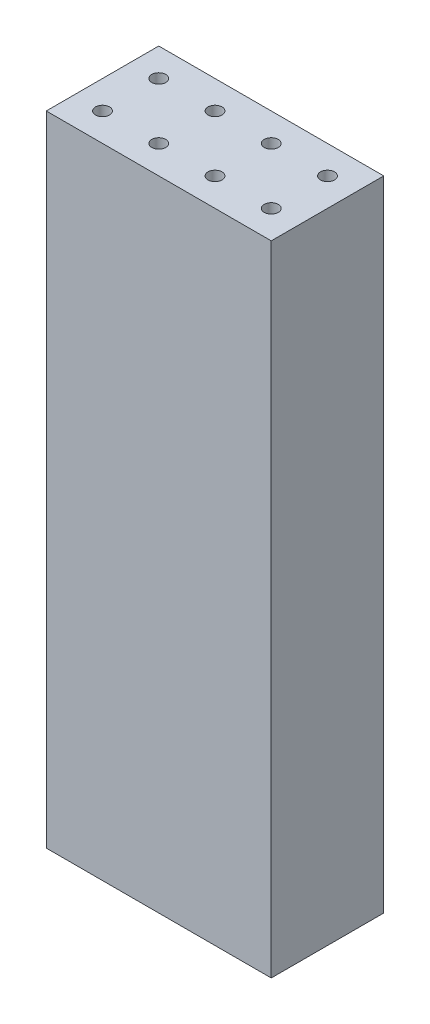
ISO-10303-21;
HEADER;
FILE_DESCRIPTION(('STEP AP214'),'2;1');
FILE_NAME('part.step','',(''),(''),'','','');
FILE_SCHEMA(('AUTOMOTIVE_DESIGN { 1 0 10303 214 1 1 1 1 }'));
ENDSEC;
DATA;
#1=APPLICATION_CONTEXT('core data for automotive mechanical design processes');
#2=APPLICATION_PROTOCOL_DEFINITION('international standard','automotive_design',2000,#1);
#3=PRODUCT_CONTEXT('',#1,'mechanical');
#4=PRODUCT('Part','Part','',(#3));
#5=PRODUCT_RELATED_PRODUCT_CATEGORY('part','',(#4));
#6=PRODUCT_DEFINITION_FORMATION('','',#4);
#7=PRODUCT_DEFINITION_CONTEXT('part definition',#1,'design');
#8=PRODUCT_DEFINITION('design','',#6,#7);
#9=PRODUCT_DEFINITION_SHAPE('','',#8);
#10=(LENGTH_UNIT() NAMED_UNIT(*) SI_UNIT(.MILLI.,.METRE.));
#11=(NAMED_UNIT(*) PLANE_ANGLE_UNIT() SI_UNIT($,.RADIAN.));
#12=(NAMED_UNIT(*) SI_UNIT($,.STERADIAN.) SOLID_ANGLE_UNIT());
#13=UNCERTAINTY_MEASURE_WITH_UNIT(LENGTH_MEASURE(1.E-05),#10,'distance_accuracy_value','');
#14=(GEOMETRIC_REPRESENTATION_CONTEXT(3) GLOBAL_UNCERTAINTY_ASSIGNED_CONTEXT((#13)) GLOBAL_UNIT_ASSIGNED_CONTEXT((#10,
#11,#12)) REPRESENTATION_CONTEXT('',''));
#15=CARTESIAN_POINT('',(0.,0.,0.));
#16=DIRECTION('',(0.,0.,1.));
#17=DIRECTION('',(1.,0.,0.));
#18=AXIS2_PLACEMENT_3D('',#15,#16,#17);
#19=CARTESIAN_POINT('',(-50.8,288.29,-25.4));
#20=DIRECTION('',(1.,0.,0.));
#21=DIRECTION('',(0.,0.,-1.));
#22=AXIS2_PLACEMENT_3D('',#19,#20,#21);
#23=PLANE('',#22);
#24=DIRECTION('',(0.,0.,1.));
#25=VECTOR('',#24,1.);
#26=CARTESIAN_POINT('',(-50.8,0.,-25.4));
#27=LINE('',#26,#25);
#28=CARTESIAN_POINT('',(-50.8,0.,-25.4));
#29=VERTEX_POINT('',#28);
#30=CARTESIAN_POINT('',(-50.8,0.,25.4));
#31=VERTEX_POINT('',#30);
#32=EDGE_CURVE('E100',#29,#31,#27,.T.);
#33=ORIENTED_EDGE('',*,*,#32,.T.);
#34=DIRECTION('',(0.,-1.,0.));
#35=VECTOR('',#34,1.);
#36=CARTESIAN_POINT('',(-50.8,288.29,25.4));
#37=LINE('',#36,#35);
#38=CARTESIAN_POINT('',(-50.8,288.29,25.4));
#39=VERTEX_POINT('',#38);
#40=EDGE_CURVE('E91',#39,#31,#37,.T.);
#41=ORIENTED_EDGE('',*,*,#40,.F.);
#42=DIRECTION('',(0.,0.,1.));
#43=VECTOR('',#42,1.);
#44=CARTESIAN_POINT('',(-50.8,288.29,-25.4));
#45=LINE('',#44,#43);
#46=CARTESIAN_POINT('',(-50.8,288.29,-25.4));
#47=VERTEX_POINT('',#46);
#48=EDGE_CURVE('E85',#47,#39,#45,.T.);
#49=ORIENTED_EDGE('',*,*,#48,.F.);
#50=DIRECTION('',(0.,-1.,0.));
#51=VECTOR('',#50,1.);
#52=CARTESIAN_POINT('',(-50.8,288.29,-25.4));
#53=LINE('',#52,#51);
#54=EDGE_CURVE('E96',#47,#29,#53,.T.);
#55=ORIENTED_EDGE('',*,*,#54,.T.);
#56=EDGE_LOOP('',(#33,#41,#49,#55));
#57=FACE_BOUND('',#56,.T.);
#58=ADVANCED_FACE('F31',(#57),#23,.F.);
#59=CARTESIAN_POINT('',(-50.8,288.29,25.4));
#60=DIRECTION('',(0.,0.,-1.));
#61=DIRECTION('',(-1.,0.,0.));
#62=AXIS2_PLACEMENT_3D('',#59,#60,#61);
#63=PLANE('',#62);
#64=DIRECTION('',(1.,0.,0.));
#65=VECTOR('',#64,1.);
#66=CARTESIAN_POINT('',(-50.8,0.,25.4));
#67=LINE('',#66,#65);
#68=CARTESIAN_POINT('',(50.8,0.,25.4));
#69=VERTEX_POINT('',#68);
#70=EDGE_CURVE('E90',#31,#69,#67,.T.);
#71=ORIENTED_EDGE('',*,*,#70,.T.);
#72=DIRECTION('',(0.,-1.,0.));
#73=VECTOR('',#72,1.);
#74=CARTESIAN_POINT('',(50.8,288.29,25.4));
#75=LINE('',#74,#73);
#76=CARTESIAN_POINT('',(50.8,288.29,25.4));
#77=VERTEX_POINT('',#76);
#78=EDGE_CURVE('E88',#77,#69,#75,.T.);
#79=ORIENTED_EDGE('',*,*,#78,.F.);
#80=DIRECTION('',(1.,0.,0.));
#81=VECTOR('',#80,1.);
#82=CARTESIAN_POINT('',(-50.8,288.29,25.4));
#83=LINE('',#82,#81);
#84=EDGE_CURVE('E79',#39,#77,#83,.T.);
#85=ORIENTED_EDGE('',*,*,#84,.F.);
#86=ORIENTED_EDGE('',*,*,#40,.T.);
#87=EDGE_LOOP('',(#71,#79,#85,#86));
#88=FACE_BOUND('',#87,.T.);
#89=ADVANCED_FACE('F89',(#88),#63,.F.);
#90=CARTESIAN_POINT('',(50.8,288.29,-25.4));
#91=DIRECTION('',(-1.,0.,0.));
#92=DIRECTION('',(0.,0.,1.));
#93=AXIS2_PLACEMENT_3D('',#90,#91,#92);
#94=PLANE('',#93);
#95=DIRECTION('',(0.,0.,-1.));
#96=VECTOR('',#95,1.);
#97=CARTESIAN_POINT('',(50.8,0.,-25.4));
#98=LINE('',#97,#96);
#99=CARTESIAN_POINT('',(50.8,0.,-25.4));
#100=VERTEX_POINT('',#99);
#101=EDGE_CURVE('E65',#69,#100,#98,.T.);
#102=ORIENTED_EDGE('',*,*,#101,.T.);
#103=DIRECTION('',(0.,-1.,0.));
#104=VECTOR('',#103,1.);
#105=CARTESIAN_POINT('',(50.8,288.29,-25.4));
#106=LINE('',#105,#104);
#107=CARTESIAN_POINT('',(50.8,288.29,-25.4));
#108=VERTEX_POINT('',#107);
#109=EDGE_CURVE('E92',#108,#100,#106,.T.);
#110=ORIENTED_EDGE('',*,*,#109,.F.);
#111=DIRECTION('',(0.,0.,-1.));
#112=VECTOR('',#111,1.);
#113=CARTESIAN_POINT('',(50.8,288.29,-25.4));
#114=LINE('',#113,#112);
#115=EDGE_CURVE('E83',#77,#108,#114,.T.);
#116=ORIENTED_EDGE('',*,*,#115,.F.);
#117=ORIENTED_EDGE('',*,*,#78,.T.);
#118=EDGE_LOOP('',(#102,#110,#116,#117));
#119=FACE_BOUND('',#118,.T.);
#120=ADVANCED_FACE('F94',(#119),#94,.F.);
#121=CARTESIAN_POINT('',(-50.8,288.29,-25.4));
#122=DIRECTION('',(0.,0.,1.));
#123=DIRECTION('',(1.,0.,0.));
#124=AXIS2_PLACEMENT_3D('',#121,#122,#123);
#125=PLANE('',#124);
#126=DIRECTION('',(-1.,0.,0.));
#127=VECTOR('',#126,1.);
#128=CARTESIAN_POINT('',(-50.8,0.,-25.4));
#129=LINE('',#128,#127);
#130=EDGE_CURVE('E71',#100,#29,#129,.T.);
#131=ORIENTED_EDGE('',*,*,#130,.T.);
#132=ORIENTED_EDGE('',*,*,#54,.F.);
#133=DIRECTION('',(-1.,0.,0.));
#134=VECTOR('',#133,1.);
#135=CARTESIAN_POINT('',(-50.8,288.29,-25.4));
#136=LINE('',#135,#134);
#137=EDGE_CURVE('E48',#108,#47,#136,.T.);
#138=ORIENTED_EDGE('',*,*,#137,.F.);
#139=ORIENTED_EDGE('',*,*,#109,.T.);
#140=EDGE_LOOP('',(#131,#132,#138,#139));
#141=FACE_BOUND('',#140,.T.);
#142=ADVANCED_FACE('F146',(#141),#125,.F.);
#143=CARTESIAN_POINT('',(-50.8,288.29,25.4));
#144=DIRECTION('',(0.,1.,0.));
#145=DIRECTION('',(0.,0.,1.));
#146=AXIS2_PLACEMENT_3D('',#143,#144,#145);
#147=PLANE('',#146);
#148=CARTESIAN_POINT('',(-12.7,288.29,-12.7));
#149=DIRECTION('',(0.,1.,0.));
#150=DIRECTION('',(0.,0.,1.));
#151=AXIS2_PLACEMENT_3D('',#148,#149,#150);
#152=CIRCLE('',#151,3.175);
#153=CARTESIAN_POINT('',(-12.7,288.29,-9.52500000000001));
#154=VERTEX_POINT('',#153);
#155=EDGE_CURVE('E366',#154,#154,#152,.T.);
#156=ORIENTED_EDGE('',*,*,#155,.F.);
#157=EDGE_LOOP('',(#156));
#158=FACE_BOUND('',#157,.T.);
#159=CARTESIAN_POINT('',(-38.1,288.29,-12.7));
#160=DIRECTION('',(0.,1.,0.));
#161=DIRECTION('',(0.,0.,1.));
#162=AXIS2_PLACEMENT_3D('',#159,#160,#161);
#163=CIRCLE('',#162,3.175);
#164=CARTESIAN_POINT('',(-38.1,288.29,-9.52500000000001));
#165=VERTEX_POINT('',#164);
#166=EDGE_CURVE('E361',#165,#165,#163,.T.);
#167=ORIENTED_EDGE('',*,*,#166,.F.);
#168=EDGE_LOOP('',(#167));
#169=FACE_BOUND('',#168,.T.);
#170=ORIENTED_EDGE('',*,*,#48,.T.);
#171=ORIENTED_EDGE('',*,*,#84,.T.);
#172=ORIENTED_EDGE('',*,*,#115,.T.);
#173=ORIENTED_EDGE('',*,*,#137,.T.);
#174=EDGE_LOOP('',(#170,#171,#172,#173));
#175=FACE_BOUND('',#174,.T.);
#176=CARTESIAN_POINT('',(12.7,288.29,-12.7));
#177=DIRECTION('',(0.,1.,0.));
#178=DIRECTION('',(0.,0.,1.));
#179=AXIS2_PLACEMENT_3D('',#176,#177,#178);
#180=CIRCLE('',#179,3.175);
#181=CARTESIAN_POINT('',(12.7,288.29,-9.52500000000001));
#182=VERTEX_POINT('',#181);
#183=EDGE_CURVE('E110',#182,#182,#180,.T.);
#184=ORIENTED_EDGE('',*,*,#183,.F.);
#185=EDGE_LOOP('',(#184));
#186=FACE_BOUND('',#185,.T.);
#187=CARTESIAN_POINT('',(38.1,288.29,-12.7));
#188=DIRECTION('',(0.,1.,0.));
#189=DIRECTION('',(0.,0.,1.));
#190=AXIS2_PLACEMENT_3D('',#187,#188,#189);
#191=CIRCLE('',#190,3.175);
#192=CARTESIAN_POINT('',(38.1,288.29,-9.52500000000001));
#193=VERTEX_POINT('',#192);
#194=EDGE_CURVE('E116',#193,#193,#191,.T.);
#195=ORIENTED_EDGE('',*,*,#194,.F.);
#196=EDGE_LOOP('',(#195));
#197=FACE_BOUND('',#196,.T.);
#198=CARTESIAN_POINT('',(-38.1,288.29,12.7));
#199=DIRECTION('',(0.,1.,0.));
#200=DIRECTION('',(0.,0.,1.));
#201=AXIS2_PLACEMENT_3D('',#198,#199,#200);
#202=CIRCLE('',#201,3.175);
#203=CARTESIAN_POINT('',(-38.1,288.29,15.875));
#204=VERTEX_POINT('',#203);
#205=EDGE_CURVE('E122',#204,#204,#202,.T.);
#206=ORIENTED_EDGE('',*,*,#205,.F.);
#207=EDGE_LOOP('',(#206));
#208=FACE_BOUND('',#207,.T.);
#209=CARTESIAN_POINT('',(-12.7,288.29,12.7));
#210=DIRECTION('',(0.,1.,0.));
#211=DIRECTION('',(0.,0.,1.));
#212=AXIS2_PLACEMENT_3D('',#209,#210,#211);
#213=CIRCLE('',#212,3.175);
#214=CARTESIAN_POINT('',(-12.7,288.29,15.875));
#215=VERTEX_POINT('',#214);
#216=EDGE_CURVE('E128',#215,#215,#213,.T.);
#217=ORIENTED_EDGE('',*,*,#216,.F.);
#218=EDGE_LOOP('',(#217));
#219=FACE_BOUND('',#218,.T.);
#220=CARTESIAN_POINT('',(12.7,288.29,12.7));
#221=DIRECTION('',(0.,1.,0.));
#222=DIRECTION('',(0.,0.,1.));
#223=AXIS2_PLACEMENT_3D('',#220,#221,#222);
#224=CIRCLE('',#223,3.175);
#225=CARTESIAN_POINT('',(12.7,288.29,15.875));
#226=VERTEX_POINT('',#225);
#227=EDGE_CURVE('E134',#226,#226,#224,.T.);
#228=ORIENTED_EDGE('',*,*,#227,.F.);
#229=EDGE_LOOP('',(#228));
#230=FACE_BOUND('',#229,.T.);
#231=CARTESIAN_POINT('',(38.1,288.29,12.7));
#232=DIRECTION('',(0.,1.,0.));
#233=DIRECTION('',(0.,0.,1.));
#234=AXIS2_PLACEMENT_3D('',#231,#232,#233);
#235=CIRCLE('',#234,3.175);
#236=CARTESIAN_POINT('',(38.1,288.29,15.875));
#237=VERTEX_POINT('',#236);
#238=EDGE_CURVE('E40',#237,#237,#235,.T.);
#239=ORIENTED_EDGE('',*,*,#238,.F.);
#240=EDGE_LOOP('',(#239));
#241=FACE_BOUND('',#240,.T.);
#242=ADVANCED_FACE('F80',(#158,#169,#175,#186,#197,#208,#219,#230,#241),#147,.T.);
#243=CARTESIAN_POINT('',(-50.8,0.,25.4));
#244=DIRECTION('',(0.,1.,0.));
#245=DIRECTION('',(0.,0.,1.));
#246=AXIS2_PLACEMENT_3D('',#243,#244,#245);
#247=PLANE('',#246);
#248=ORIENTED_EDGE('',*,*,#32,.F.);
#249=ORIENTED_EDGE('',*,*,#130,.F.);
#250=ORIENTED_EDGE('',*,*,#101,.F.);
#251=ORIENTED_EDGE('',*,*,#70,.F.);
#252=EDGE_LOOP('',(#248,#249,#250,#251));
#253=FACE_BOUND('',#252,.T.);
#254=ADVANCED_FACE('F145',(#253),#247,.F.);
#255=CARTESIAN_POINT('',(-38.1,278.29,-12.7));
#256=DIRECTION('',(0.,1.,0.));
#257=DIRECTION('',(0.,0.,1.));
#258=AXIS2_PLACEMENT_3D('',#255,#256,#257);
#259=CYLINDRICAL_SURFACE('',#258,3.175);
#260=CARTESIAN_POINT('',(-38.1,278.29,-12.7));
#261=DIRECTION('',(0.,1.,0.));
#262=DIRECTION('',(0.,0.,1.));
#263=AXIS2_PLACEMENT_3D('',#260,#261,#262);
#264=CIRCLE('',#263,3.175);
#265=CARTESIAN_POINT('',(-38.1,278.29,-9.52500000000001));
#266=VERTEX_POINT('',#265);
#267=EDGE_CURVE('E103',#266,#266,#264,.T.);
#268=ORIENTED_EDGE('',*,*,#267,.F.);
#269=EDGE_LOOP('',(#268));
#270=FACE_BOUND('',#269,.T.);
#271=ORIENTED_EDGE('',*,*,#166,.T.);
#272=EDGE_LOOP('',(#271));
#273=FACE_BOUND('',#272,.T.);
#274=ADVANCED_FACE('F154',(#270,#273),#259,.F.);
#275=CARTESIAN_POINT('',(-38.1,278.29,-12.7));
#276=DIRECTION('',(0.,1.,0.));
#277=DIRECTION('',(0.,0.,1.));
#278=AXIS2_PLACEMENT_3D('',#275,#276,#277);
#279=PLANE('',#278);
#280=ORIENTED_EDGE('',*,*,#267,.T.);
#281=EDGE_LOOP('',(#280));
#282=FACE_BOUND('',#281,.T.);
#283=ADVANCED_FACE('F269',(#282),#279,.T.);
#284=CARTESIAN_POINT('',(-12.7,278.29,-12.7));
#285=DIRECTION('',(0.,1.,0.));
#286=DIRECTION('',(0.,0.,1.));
#287=AXIS2_PLACEMENT_3D('',#284,#285,#286);
#288=CYLINDRICAL_SURFACE('',#287,3.175);
#289=CARTESIAN_POINT('',(-12.7,278.29,-12.7));
#290=DIRECTION('',(0.,1.,0.));
#291=DIRECTION('',(0.,0.,1.));
#292=AXIS2_PLACEMENT_3D('',#289,#290,#291);
#293=CIRCLE('',#292,3.175);
#294=CARTESIAN_POINT('',(-12.7,278.29,-9.52500000000001));
#295=VERTEX_POINT('',#294);
#296=EDGE_CURVE('E362',#295,#295,#293,.T.);
#297=ORIENTED_EDGE('',*,*,#296,.F.);
#298=EDGE_LOOP('',(#297));
#299=FACE_BOUND('',#298,.T.);
#300=ORIENTED_EDGE('',*,*,#155,.T.);
#301=EDGE_LOOP('',(#300));
#302=FACE_BOUND('',#301,.T.);
#303=ADVANCED_FACE('F181',(#299,#302),#288,.F.);
#304=CARTESIAN_POINT('',(-12.7,278.29,-12.7));
#305=DIRECTION('',(0.,1.,0.));
#306=DIRECTION('',(0.,0.,1.));
#307=AXIS2_PLACEMENT_3D('',#304,#305,#306);
#308=PLANE('',#307);
#309=ORIENTED_EDGE('',*,*,#296,.T.);
#310=EDGE_LOOP('',(#309));
#311=FACE_BOUND('',#310,.T.);
#312=ADVANCED_FACE('F179',(#311),#308,.T.);
#313=CARTESIAN_POINT('',(12.7,278.29,-12.7));
#314=DIRECTION('',(0.,1.,0.));
#315=DIRECTION('',(0.,0.,1.));
#316=AXIS2_PLACEMENT_3D('',#313,#314,#315);
#317=PLANE('',#316);
#318=CARTESIAN_POINT('',(12.7,278.29,-12.7));
#319=DIRECTION('',(0.,1.,0.));
#320=DIRECTION('',(0.,0.,1.));
#321=AXIS2_PLACEMENT_3D('',#318,#319,#320);
#322=CIRCLE('',#321,3.175);
#323=CARTESIAN_POINT('',(12.7,278.29,-9.52500000000001));
#324=VERTEX_POINT('',#323);
#325=EDGE_CURVE('E113',#324,#324,#322,.T.);
#326=ORIENTED_EDGE('',*,*,#325,.T.);
#327=EDGE_LOOP('',(#326));
#328=FACE_BOUND('',#327,.T.);
#329=ADVANCED_FACE('F175',(#328),#317,.T.);
#330=CARTESIAN_POINT('',(12.7,278.29,-12.7));
#331=DIRECTION('',(0.,1.,0.));
#332=DIRECTION('',(0.,0.,1.));
#333=AXIS2_PLACEMENT_3D('',#330,#331,#332);
#334=CYLINDRICAL_SURFACE('',#333,3.175);
#335=ORIENTED_EDGE('',*,*,#325,.F.);
#336=EDGE_LOOP('',(#335));
#337=FACE_BOUND('',#336,.T.);
#338=ORIENTED_EDGE('',*,*,#183,.T.);
#339=EDGE_LOOP('',(#338));
#340=FACE_BOUND('',#339,.T.);
#341=ADVANCED_FACE('F171',(#337,#340),#334,.F.);
#342=CARTESIAN_POINT('',(38.1,278.29,-12.7));
#343=DIRECTION('',(0.,1.,0.));
#344=DIRECTION('',(0.,0.,1.));
#345=AXIS2_PLACEMENT_3D('',#342,#343,#344);
#346=PLANE('',#345);
#347=CARTESIAN_POINT('',(38.1,278.29,-12.7));
#348=DIRECTION('',(0.,1.,0.));
#349=DIRECTION('',(0.,0.,1.));
#350=AXIS2_PLACEMENT_3D('',#347,#348,#349);
#351=CIRCLE('',#350,3.175);
#352=CARTESIAN_POINT('',(38.1,278.29,-9.52500000000001));
#353=VERTEX_POINT('',#352);
#354=EDGE_CURVE('E119',#353,#353,#351,.T.);
#355=ORIENTED_EDGE('',*,*,#354,.T.);
#356=EDGE_LOOP('',(#355));
#357=FACE_BOUND('',#356,.T.);
#358=ADVANCED_FACE('F174',(#357),#346,.T.);
#359=CARTESIAN_POINT('',(38.1,278.29,-12.7));
#360=DIRECTION('',(0.,1.,0.));
#361=DIRECTION('',(0.,0.,1.));
#362=AXIS2_PLACEMENT_3D('',#359,#360,#361);
#363=CYLINDRICAL_SURFACE('',#362,3.175);
#364=ORIENTED_EDGE('',*,*,#354,.F.);
#365=EDGE_LOOP('',(#364));
#366=FACE_BOUND('',#365,.T.);
#367=ORIENTED_EDGE('',*,*,#194,.T.);
#368=EDGE_LOOP('',(#367));
#369=FACE_BOUND('',#368,.T.);
#370=ADVANCED_FACE('F182',(#366,#369),#363,.F.);
#371=CARTESIAN_POINT('',(-38.1,278.29,12.7));
#372=DIRECTION('',(0.,1.,0.));
#373=DIRECTION('',(0.,0.,1.));
#374=AXIS2_PLACEMENT_3D('',#371,#372,#373);
#375=PLANE('',#374);
#376=CARTESIAN_POINT('',(-38.1,278.29,12.7));
#377=DIRECTION('',(0.,1.,0.));
#378=DIRECTION('',(0.,0.,1.));
#379=AXIS2_PLACEMENT_3D('',#376,#377,#378);
#380=CIRCLE('',#379,3.175);
#381=CARTESIAN_POINT('',(-38.1,278.29,15.875));
#382=VERTEX_POINT('',#381);
#383=EDGE_CURVE('E125',#382,#382,#380,.T.);
#384=ORIENTED_EDGE('',*,*,#383,.T.);
#385=EDGE_LOOP('',(#384));
#386=FACE_BOUND('',#385,.T.);
#387=ADVANCED_FACE('F185',(#386),#375,.T.);
#388=CARTESIAN_POINT('',(-38.1,278.29,12.7));
#389=DIRECTION('',(0.,1.,0.));
#390=DIRECTION('',(0.,0.,1.));
#391=AXIS2_PLACEMENT_3D('',#388,#389,#390);
#392=CYLINDRICAL_SURFACE('',#391,3.175);
#393=ORIENTED_EDGE('',*,*,#383,.F.);
#394=EDGE_LOOP('',(#393));
#395=FACE_BOUND('',#394,.T.);
#396=ORIENTED_EDGE('',*,*,#205,.T.);
#397=EDGE_LOOP('',(#396));
#398=FACE_BOUND('',#397,.T.);
#399=ADVANCED_FACE('F190',(#395,#398),#392,.F.);
#400=CARTESIAN_POINT('',(-12.7,278.29,12.7));
#401=DIRECTION('',(0.,1.,0.));
#402=DIRECTION('',(0.,0.,1.));
#403=AXIS2_PLACEMENT_3D('',#400,#401,#402);
#404=PLANE('',#403);
#405=CARTESIAN_POINT('',(-12.7,278.29,12.7));
#406=DIRECTION('',(0.,1.,0.));
#407=DIRECTION('',(0.,0.,1.));
#408=AXIS2_PLACEMENT_3D('',#405,#406,#407);
#409=CIRCLE('',#408,3.175);
#410=CARTESIAN_POINT('',(-12.7,278.29,15.875));
#411=VERTEX_POINT('',#410);
#412=EDGE_CURVE('E131',#411,#411,#409,.T.);
#413=ORIENTED_EDGE('',*,*,#412,.T.);
#414=EDGE_LOOP('',(#413));
#415=FACE_BOUND('',#414,.T.);
#416=ADVANCED_FACE('F193',(#415),#404,.T.);
#417=CARTESIAN_POINT('',(-12.7,278.29,12.7));
#418=DIRECTION('',(0.,1.,0.));
#419=DIRECTION('',(0.,0.,1.));
#420=AXIS2_PLACEMENT_3D('',#417,#418,#419);
#421=CYLINDRICAL_SURFACE('',#420,3.175);
#422=ORIENTED_EDGE('',*,*,#412,.F.);
#423=EDGE_LOOP('',(#422));
#424=FACE_BOUND('',#423,.T.);
#425=ORIENTED_EDGE('',*,*,#216,.T.);
#426=EDGE_LOOP('',(#425));
#427=FACE_BOUND('',#426,.T.);
#428=ADVANCED_FACE('F198',(#424,#427),#421,.F.);
#429=CARTESIAN_POINT('',(12.7,278.29,12.7));
#430=DIRECTION('',(0.,1.,0.));
#431=DIRECTION('',(0.,0.,1.));
#432=AXIS2_PLACEMENT_3D('',#429,#430,#431);
#433=PLANE('',#432);
#434=CARTESIAN_POINT('',(12.7,278.29,12.7));
#435=DIRECTION('',(0.,1.,0.));
#436=DIRECTION('',(0.,0.,1.));
#437=AXIS2_PLACEMENT_3D('',#434,#435,#436);
#438=CIRCLE('',#437,3.175);
#439=CARTESIAN_POINT('',(12.7,278.29,15.875));
#440=VERTEX_POINT('',#439);
#441=EDGE_CURVE('E137',#440,#440,#438,.T.);
#442=ORIENTED_EDGE('',*,*,#441,.T.);
#443=EDGE_LOOP('',(#442));
#444=FACE_BOUND('',#443,.T.);
#445=ADVANCED_FACE('F201',(#444),#433,.T.);
#446=CARTESIAN_POINT('',(12.7,278.29,12.7));
#447=DIRECTION('',(0.,1.,0.));
#448=DIRECTION('',(0.,0.,1.));
#449=AXIS2_PLACEMENT_3D('',#446,#447,#448);
#450=CYLINDRICAL_SURFACE('',#449,3.175);
#451=ORIENTED_EDGE('',*,*,#441,.F.);
#452=EDGE_LOOP('',(#451));
#453=FACE_BOUND('',#452,.T.);
#454=ORIENTED_EDGE('',*,*,#227,.T.);
#455=EDGE_LOOP('',(#454));
#456=FACE_BOUND('',#455,.T.);
#457=ADVANCED_FACE('F206',(#453,#456),#450,.F.);
#458=CARTESIAN_POINT('',(38.1,278.29,12.7));
#459=DIRECTION('',(0.,1.,0.));
#460=DIRECTION('',(0.,0.,1.));
#461=AXIS2_PLACEMENT_3D('',#458,#459,#460);
#462=PLANE('',#461);
#463=CARTESIAN_POINT('',(38.1,278.29,12.7));
#464=DIRECTION('',(0.,1.,0.));
#465=DIRECTION('',(0.,0.,1.));
#466=AXIS2_PLACEMENT_3D('',#463,#464,#465);
#467=CIRCLE('',#466,3.175);
#468=CARTESIAN_POINT('',(38.1,278.29,15.875));
#469=VERTEX_POINT('',#468);
#470=EDGE_CURVE('E11',#469,#469,#467,.T.);
#471=ORIENTED_EDGE('',*,*,#470,.T.);
#472=EDGE_LOOP('',(#471));
#473=FACE_BOUND('',#472,.T.);
#474=ADVANCED_FACE('F33',(#473),#462,.T.);
#475=CARTESIAN_POINT('',(38.1,278.29,12.7));
#476=DIRECTION('',(0.,1.,0.));
#477=DIRECTION('',(0.,0.,1.));
#478=AXIS2_PLACEMENT_3D('',#475,#476,#477);
#479=CYLINDRICAL_SURFACE('',#478,3.175);
#480=ORIENTED_EDGE('',*,*,#470,.F.);
#481=EDGE_LOOP('',(#480));
#482=FACE_BOUND('',#481,.T.);
#483=ORIENTED_EDGE('',*,*,#238,.T.);
#484=EDGE_LOOP('',(#483));
#485=FACE_BOUND('',#484,.T.);
#486=ADVANCED_FACE('F142',(#482,#485),#479,.F.);
#487=CLOSED_SHELL('',(#58,#89,#120,#142,#242,#254,#274,#283,#303,#312,#329,#341,#358,#370,#387,
#399,#416,#428,#445,#457,#474,#486));
#488=MANIFOLD_SOLID_BREP('B2',#487);
#489=ADVANCED_BREP_SHAPE_REPRESENTATION('',(#18,#488),#14);
#490=SHAPE_DEFINITION_REPRESENTATION(#9,#489);
ENDSEC;
END-ISO-10303-21;
